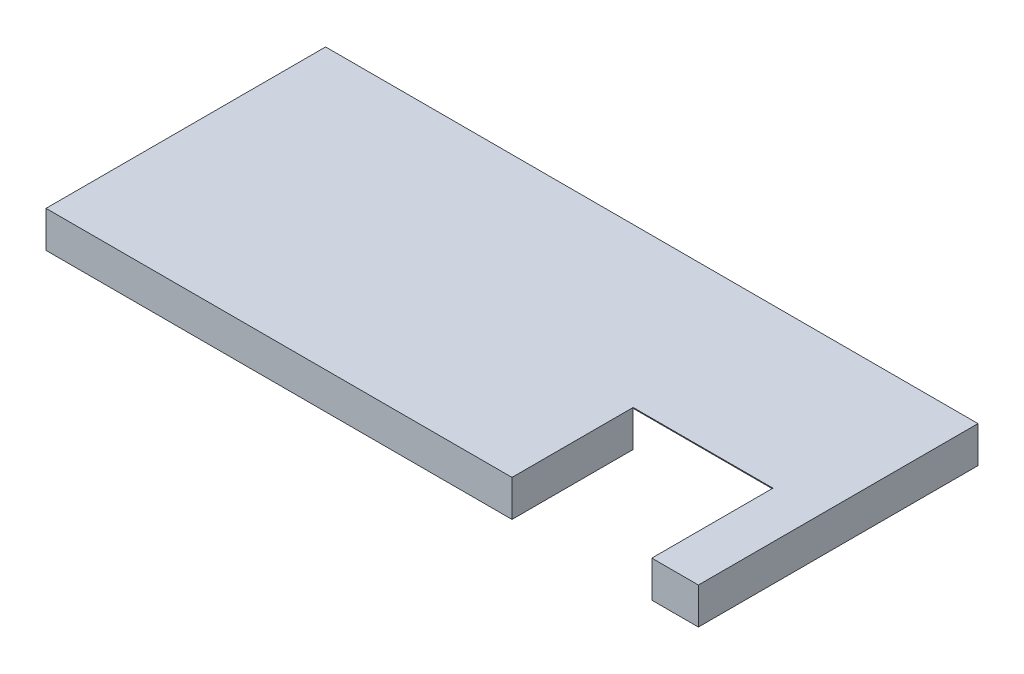
ISO-10303-21;
HEADER;
FILE_DESCRIPTION(('STEP AP214'),'2;1');
FILE_NAME('part.step','',(''),(''),'','','');
FILE_SCHEMA(('AUTOMOTIVE_DESIGN { 1 0 10303 214 1 1 1 1 }'));
ENDSEC;
DATA;
#1=APPLICATION_CONTEXT('core data for automotive mechanical design processes');
#2=APPLICATION_PROTOCOL_DEFINITION('international standard','automotive_design',2000,#1);
#3=PRODUCT_CONTEXT('',#1,'mechanical');
#4=PRODUCT('Part','Part','',(#3));
#5=PRODUCT_RELATED_PRODUCT_CATEGORY('part','',(#4));
#6=PRODUCT_DEFINITION_FORMATION('','',#4);
#7=PRODUCT_DEFINITION_CONTEXT('part definition',#1,'design');
#8=PRODUCT_DEFINITION('design','',#6,#7);
#9=PRODUCT_DEFINITION_SHAPE('','',#8);
#10=(LENGTH_UNIT() NAMED_UNIT(*) SI_UNIT(.MILLI.,.METRE.));
#11=(NAMED_UNIT(*) PLANE_ANGLE_UNIT() SI_UNIT($,.RADIAN.));
#12=(NAMED_UNIT(*) SI_UNIT($,.STERADIAN.) SOLID_ANGLE_UNIT());
#13=UNCERTAINTY_MEASURE_WITH_UNIT(LENGTH_MEASURE(1.E-05),#10,'distance_accuracy_value','');
#14=(GEOMETRIC_REPRESENTATION_CONTEXT(3) GLOBAL_UNCERTAINTY_ASSIGNED_CONTEXT((#13)) GLOBAL_UNIT_ASSIGNED_CONTEXT((#10,
#11,#12)) REPRESENTATION_CONTEXT('',''));
#15=CARTESIAN_POINT('',(0.,0.,0.));
#16=DIRECTION('',(0.,0.,1.));
#17=DIRECTION('',(1.,0.,0.));
#18=AXIS2_PLACEMENT_3D('',#15,#16,#17);
#19=CARTESIAN_POINT('',(0.,0.,0.));
#20=DIRECTION('',(0.,1.,0.));
#21=DIRECTION('',(0.,0.,1.));
#22=AXIS2_PLACEMENT_3D('',#19,#20,#21);
#23=PLANE('',#22);
#24=DIRECTION('',(0.,0.,-1.));
#25=VECTOR('',#24,1.);
#26=CARTESIAN_POINT('',(4991.,0.,1700.));
#27=LINE('',#26,#25);
#28=CARTESIAN_POINT('',(4991.,0.,2991.));
#29=VERTEX_POINT('',#28);
#30=CARTESIAN_POINT('',(4991.,0.,1700.));
#31=VERTEX_POINT('',#30);
#32=EDGE_CURVE('E318',#29,#31,#27,.T.);
#33=ORIENTED_EDGE('',*,*,#32,.F.);
#34=DIRECTION('',(1.,0.,0.));
#35=VECTOR('',#34,1.);
#36=CARTESIAN_POINT('',(5000.,0.,2991.));
#37=LINE('',#36,#35);
#38=CARTESIAN_POINT('',(9.,0.,2991.));
#39=VERTEX_POINT('',#38);
#40=EDGE_CURVE('E183',#39,#29,#37,.T.);
#41=ORIENTED_EDGE('',*,*,#40,.F.);
#42=DIRECTION('',(0.,0.,1.));
#43=VECTOR('',#42,1.);
#44=CARTESIAN_POINT('',(9.00000000000001,0.,0.));
#45=LINE('',#44,#43);
#46=CARTESIAN_POINT('',(9.00000000000034,0.,8.99999999999914));
#47=VERTEX_POINT('',#46);
#48=EDGE_CURVE('E253',#47,#39,#45,.T.);
#49=ORIENTED_EDGE('',*,*,#48,.F.);
#50=DIRECTION('',(-1.,0.,0.));
#51=VECTOR('',#50,1.);
#52=CARTESIAN_POINT('',(7000.,0.,9.00000000000001));
#53=LINE('',#52,#51);
#54=CARTESIAN_POINT('',(6991.,0.,9.00000000000001));
#55=VERTEX_POINT('',#54);
#56=EDGE_CURVE('E281',#55,#47,#53,.T.);
#57=ORIENTED_EDGE('',*,*,#56,.F.);
#58=DIRECTION('',(0.,0.,-1.));
#59=VECTOR('',#58,1.);
#60=CARTESIAN_POINT('',(6991.,0.,3000.));
#61=LINE('',#60,#59);
#62=CARTESIAN_POINT('',(6991.,0.,2991.));
#63=VERTEX_POINT('',#62);
#64=EDGE_CURVE('E289',#63,#55,#61,.T.);
#65=ORIENTED_EDGE('',*,*,#64,.F.);
#66=DIRECTION('',(1.,0.,0.));
#67=VECTOR('',#66,1.);
#68=CARTESIAN_POINT('',(6500.,0.,2991.));
#69=LINE('',#68,#67);
#70=CARTESIAN_POINT('',(6509.,0.,2991.));
#71=VERTEX_POINT('',#70);
#72=EDGE_CURVE('E297',#71,#63,#69,.T.);
#73=ORIENTED_EDGE('',*,*,#72,.F.);
#74=DIRECTION('',(0.,0.,1.));
#75=VECTOR('',#74,1.);
#76=CARTESIAN_POINT('',(6509.,0.,1700.));
#77=LINE('',#76,#75);
#78=CARTESIAN_POINT('',(6509.,0.,1700.));
#79=VERTEX_POINT('',#78);
#80=EDGE_CURVE('E309',#79,#71,#77,.T.);
#81=ORIENTED_EDGE('',*,*,#80,.F.);
#82=DIRECTION('',(1.,0.,0.));
#83=VECTOR('',#82,1.);
#84=CARTESIAN_POINT('',(6500.,0.,1700.));
#85=LINE('',#84,#83);
#86=CARTESIAN_POINT('',(6500.,0.,1700.));
#87=VERTEX_POINT('',#86);
#88=EDGE_CURVE('E184',#87,#79,#85,.T.);
#89=ORIENTED_EDGE('',*,*,#88,.F.);
#90=DIRECTION('',(1.,0.,0.));
#91=VECTOR('',#90,1.);
#92=CARTESIAN_POINT('',(6500.,0.,1700.));
#93=LINE('',#92,#91);
#94=CARTESIAN_POINT('',(5000.,0.,1700.));
#95=VERTEX_POINT('',#94);
#96=EDGE_CURVE('E191',#95,#87,#93,.T.);
#97=ORIENTED_EDGE('',*,*,#96,.F.);
#98=DIRECTION('',(1.,0.,0.));
#99=VECTOR('',#98,1.);
#100=CARTESIAN_POINT('',(5000.,0.,1700.));
#101=LINE('',#100,#99);
#102=EDGE_CURVE('E174',#31,#95,#101,.T.);
#103=ORIENTED_EDGE('',*,*,#102,.F.);
#104=EDGE_LOOP('',(#33,#41,#49,#57,#65,#73,#81,#89,#97,#103));
#105=FACE_BOUND('',#104,.T.);
#106=ADVANCED_FACE('F45',(#105),#23,.F.);
#107=CARTESIAN_POINT('',(5000.,-382.,2991.));
#108=DIRECTION('',(0.,0.,1.));
#109=DIRECTION('',(1.,0.,0.));
#110=AXIS2_PLACEMENT_3D('',#107,#108,#109);
#111=PLANE('',#110);
#112=DIRECTION('',(0.,1.,0.));
#113=VECTOR('',#112,1.);
#114=CARTESIAN_POINT('',(4991.,-382.,2991.));
#115=LINE('',#114,#113);
#116=CARTESIAN_POINT('',(4991.,-382.,2991.));
#117=VERTEX_POINT('',#116);
#118=EDGE_CURVE('E166',#117,#29,#115,.T.);
#119=ORIENTED_EDGE('',*,*,#118,.F.);
#120=DIRECTION('',(1.,0.,0.));
#121=VECTOR('',#120,1.);
#122=CARTESIAN_POINT('',(5000.,-382.,2991.));
#123=LINE('',#122,#121);
#124=CARTESIAN_POINT('',(9.00000000000034,-382.,2991.));
#125=VERTEX_POINT('',#124);
#126=EDGE_CURVE('E181',#125,#117,#123,.T.);
#127=ORIENTED_EDGE('',*,*,#126,.F.);
#128=DIRECTION('',(0.,1.,0.));
#129=VECTOR('',#128,1.);
#130=CARTESIAN_POINT('',(9.,-382.,2991.));
#131=LINE('',#130,#129);
#132=EDGE_CURVE('E204',#125,#39,#131,.T.);
#133=ORIENTED_EDGE('',*,*,#132,.T.);
#134=ORIENTED_EDGE('',*,*,#40,.T.);
#135=EDGE_LOOP('',(#119,#127,#133,#134));
#136=FACE_BOUND('',#135,.T.);
#137=ADVANCED_FACE('F179',(#136),#111,.F.);
#138=CARTESIAN_POINT('',(6500.,-382.,2991.));
#139=DIRECTION('',(0.,0.,1.));
#140=DIRECTION('',(1.,0.,0.));
#141=AXIS2_PLACEMENT_3D('',#138,#139,#140);
#142=PLANE('',#141);
#143=DIRECTION('',(0.,1.,0.));
#144=VECTOR('',#143,1.);
#145=CARTESIAN_POINT('',(6509.,-382.,2991.));
#146=LINE('',#145,#144);
#147=CARTESIAN_POINT('',(6509.,-382.,2991.));
#148=VERTEX_POINT('',#147);
#149=EDGE_CURVE('E60',#148,#71,#146,.T.);
#150=ORIENTED_EDGE('',*,*,#149,.T.);
#151=ORIENTED_EDGE('',*,*,#72,.T.);
#152=DIRECTION('',(0.,1.,0.));
#153=VECTOR('',#152,1.);
#154=CARTESIAN_POINT('',(6991.,-382.,2991.));
#155=LINE('',#154,#153);
#156=CARTESIAN_POINT('',(6991.,-382.,2991.));
#157=VERTEX_POINT('',#156);
#158=EDGE_CURVE('E292',#157,#63,#155,.T.);
#159=ORIENTED_EDGE('',*,*,#158,.F.);
#160=DIRECTION('',(1.,0.,0.));
#161=VECTOR('',#160,1.);
#162=CARTESIAN_POINT('',(6500.,-382.,2991.));
#163=LINE('',#162,#161);
#164=EDGE_CURVE('E67',#148,#157,#163,.T.);
#165=ORIENTED_EDGE('',*,*,#164,.F.);
#166=EDGE_LOOP('',(#150,#151,#159,#165));
#167=FACE_BOUND('',#166,.T.);
#168=ADVANCED_FACE('F342',(#167),#142,.F.);
#169=CARTESIAN_POINT('',(6991.,-382.,3000.));
#170=DIRECTION('',(1.,0.,0.));
#171=DIRECTION('',(0.,0.,-1.));
#172=AXIS2_PLACEMENT_3D('',#169,#170,#171);
#173=PLANE('',#172);
#174=ORIENTED_EDGE('',*,*,#158,.T.);
#175=ORIENTED_EDGE('',*,*,#64,.T.);
#176=DIRECTION('',(0.,1.,0.));
#177=VECTOR('',#176,1.);
#178=CARTESIAN_POINT('',(6991.,-382.,9.00000000000001));
#179=LINE('',#178,#177);
#180=CARTESIAN_POINT('',(6991.,-382.,9.00000000000001));
#181=VERTEX_POINT('',#180);
#182=EDGE_CURVE('E284',#181,#55,#179,.T.);
#183=ORIENTED_EDGE('',*,*,#182,.F.);
#184=DIRECTION('',(0.,0.,-1.));
#185=VECTOR('',#184,1.);
#186=CARTESIAN_POINT('',(6991.,-382.,3000.));
#187=LINE('',#186,#185);
#188=EDGE_CURVE('E288',#157,#181,#187,.T.);
#189=ORIENTED_EDGE('',*,*,#188,.F.);
#190=EDGE_LOOP('',(#174,#175,#183,#189));
#191=FACE_BOUND('',#190,.T.);
#192=ADVANCED_FACE('F348',(#191),#173,.F.);
#193=CARTESIAN_POINT('',(7000.,-382.,9.00000000000001));
#194=DIRECTION('',(0.,0.,-1.));
#195=DIRECTION('',(-1.,0.,0.));
#196=AXIS2_PLACEMENT_3D('',#193,#194,#195);
#197=PLANE('',#196);
#198=ORIENTED_EDGE('',*,*,#182,.T.);
#199=ORIENTED_EDGE('',*,*,#56,.T.);
#200=DIRECTION('',(0.,1.,0.));
#201=VECTOR('',#200,1.);
#202=CARTESIAN_POINT('',(9.00000000000034,-382.,8.99999999999914));
#203=LINE('',#202,#201);
#204=CARTESIAN_POINT('',(9.00000000000001,-382.,9.00000000000001));
#205=VERTEX_POINT('',#204);
#206=EDGE_CURVE('E256',#205,#47,#203,.T.);
#207=ORIENTED_EDGE('',*,*,#206,.F.);
#208=DIRECTION('',(-1.,0.,0.));
#209=VECTOR('',#208,1.);
#210=CARTESIAN_POINT('',(7000.,-382.,9.00000000000001));
#211=LINE('',#210,#209);
#212=EDGE_CURVE('E280',#181,#205,#211,.T.);
#213=ORIENTED_EDGE('',*,*,#212,.F.);
#214=EDGE_LOOP('',(#198,#199,#207,#213));
#215=FACE_BOUND('',#214,.T.);
#216=ADVANCED_FACE('F353',(#215),#197,.F.);
#217=CARTESIAN_POINT('',(9.00000000000001,-382.,0.));
#218=DIRECTION('',(-1.,0.,0.));
#219=DIRECTION('',(0.,0.,1.));
#220=AXIS2_PLACEMENT_3D('',#217,#218,#219);
#221=PLANE('',#220);
#222=ORIENTED_EDGE('',*,*,#206,.T.);
#223=ORIENTED_EDGE('',*,*,#48,.T.);
#224=ORIENTED_EDGE('',*,*,#132,.F.);
#225=DIRECTION('',(0.,0.,1.));
#226=VECTOR('',#225,1.);
#227=CARTESIAN_POINT('',(9.00000000000001,-382.,0.));
#228=LINE('',#227,#226);
#229=EDGE_CURVE('E189',#205,#125,#228,.T.);
#230=ORIENTED_EDGE('',*,*,#229,.F.);
#231=EDGE_LOOP('',(#222,#223,#224,#230));
#232=FACE_BOUND('',#231,.T.);
#233=ADVANCED_FACE('F357',(#232),#221,.F.);
#234=CARTESIAN_POINT('',(4.44089209850063E-13,9.,3000.));
#235=DIRECTION('',(0.,0.,-1.));
#236=DIRECTION('',(-1.,0.,0.));
#237=AXIS2_PLACEMENT_3D('',#234,#235,#236);
#238=PLANE('',#237);
#239=DIRECTION('',(1.,0.,0.));
#240=VECTOR('',#239,1.);
#241=CARTESIAN_POINT('',(4.44089209850063E-13,9.,3000.));
#242=LINE('',#241,#240);
#243=CARTESIAN_POINT('',(6500.,9.,3000.));
#244=VERTEX_POINT('',#243);
#245=CARTESIAN_POINT('',(7000.,9.,3000.));
#246=VERTEX_POINT('',#245);
#247=EDGE_CURVE('E230',#244,#246,#242,.T.);
#248=ORIENTED_EDGE('',*,*,#247,.F.);
#249=DIRECTION('',(0.,-1.,0.));
#250=VECTOR('',#249,1.);
#251=CARTESIAN_POINT('',(6500.,9.,3000.));
#252=LINE('',#251,#250);
#253=CARTESIAN_POINT('',(6500.,-382.,3000.));
#254=VERTEX_POINT('',#253);
#255=EDGE_CURVE('E212',#244,#254,#252,.T.);
#256=ORIENTED_EDGE('',*,*,#255,.T.);
#257=DIRECTION('',(-1.,0.,0.));
#258=VECTOR('',#257,1.);
#259=CARTESIAN_POINT('',(7000.,-382.,3000.));
#260=LINE('',#259,#258);
#261=CARTESIAN_POINT('',(7000.,-382.,3000.));
#262=VERTEX_POINT('',#261);
#263=EDGE_CURVE('E291',#262,#254,#260,.T.);
#264=ORIENTED_EDGE('',*,*,#263,.F.);
#265=DIRECTION('',(0.,-1.,0.));
#266=VECTOR('',#265,1.);
#267=CARTESIAN_POINT('',(7000.,9.,3000.));
#268=LINE('',#267,#266);
#269=EDGE_CURVE('E234',#246,#262,#268,.T.);
#270=ORIENTED_EDGE('',*,*,#269,.F.);
#271=EDGE_LOOP('',(#248,#256,#264,#270));
#272=FACE_BOUND('',#271,.T.);
#273=ADVANCED_FACE('F333',(#272),#238,.F.);
#274=CARTESIAN_POINT('',(7000.,9.,0.));
#275=DIRECTION('',(-1.,0.,0.));
#276=DIRECTION('',(0.,0.,1.));
#277=AXIS2_PLACEMENT_3D('',#274,#275,#276);
#278=PLANE('',#277);
#279=ORIENTED_EDGE('',*,*,#269,.T.);
#280=DIRECTION('',(0.,0.,1.));
#281=VECTOR('',#280,1.);
#282=CARTESIAN_POINT('',(7000.,-382.,0.));
#283=LINE('',#282,#281);
#284=CARTESIAN_POINT('',(7000.,-382.,0.));
#285=VERTEX_POINT('',#284);
#286=EDGE_CURVE('E277',#285,#262,#283,.T.);
#287=ORIENTED_EDGE('',*,*,#286,.F.);
#288=DIRECTION('',(0.,-1.,0.));
#289=VECTOR('',#288,1.);
#290=CARTESIAN_POINT('',(7000.,9.,0.));
#291=LINE('',#290,#289);
#292=CARTESIAN_POINT('',(7000.,9.,0.));
#293=VERTEX_POINT('',#292);
#294=EDGE_CURVE('E11',#293,#285,#291,.T.);
#295=ORIENTED_EDGE('',*,*,#294,.F.);
#296=DIRECTION('',(0.,0.,-1.));
#297=VECTOR('',#296,1.);
#298=CARTESIAN_POINT('',(7000.,9.,0.));
#299=LINE('',#298,#297);
#300=EDGE_CURVE('E217',#246,#293,#299,.T.);
#301=ORIENTED_EDGE('',*,*,#300,.F.);
#302=EDGE_LOOP('',(#279,#287,#295,#301));
#303=FACE_BOUND('',#302,.T.);
#304=ADVANCED_FACE('F47',(#303),#278,.F.);
#305=CARTESIAN_POINT('',(0.,9.,0.));
#306=DIRECTION('',(0.,0.,1.));
#307=DIRECTION('',(1.,0.,0.));
#308=AXIS2_PLACEMENT_3D('',#305,#306,#307);
#309=PLANE('',#308);
#310=ORIENTED_EDGE('',*,*,#294,.T.);
#311=DIRECTION('',(1.,0.,0.));
#312=VECTOR('',#311,1.);
#313=CARTESIAN_POINT('',(0.,-382.,0.));
#314=LINE('',#313,#312);
#315=CARTESIAN_POINT('',(0.,-382.,0.));
#316=VERTEX_POINT('',#315);
#317=EDGE_CURVE('E248',#316,#285,#314,.T.);
#318=ORIENTED_EDGE('',*,*,#317,.F.);
#319=DIRECTION('',(0.,-1.,0.));
#320=VECTOR('',#319,1.);
#321=CARTESIAN_POINT('',(0.,9.,0.));
#322=LINE('',#321,#320);
#323=CARTESIAN_POINT('',(0.,9.,0.));
#324=VERTEX_POINT('',#323);
#325=EDGE_CURVE('E53',#324,#316,#322,.T.);
#326=ORIENTED_EDGE('',*,*,#325,.F.);
#327=DIRECTION('',(-1.,0.,0.));
#328=VECTOR('',#327,1.);
#329=CARTESIAN_POINT('',(0.,9.,0.));
#330=LINE('',#329,#328);
#331=EDGE_CURVE('E226',#293,#324,#330,.T.);
#332=ORIENTED_EDGE('',*,*,#331,.F.);
#333=EDGE_LOOP('',(#310,#318,#326,#332));
#334=FACE_BOUND('',#333,.T.);
#335=ADVANCED_FACE('F251',(#334),#309,.F.);
#336=CARTESIAN_POINT('',(0.,9.,0.));
#337=DIRECTION('',(1.,0.,0.));
#338=DIRECTION('',(0.,0.,-1.));
#339=AXIS2_PLACEMENT_3D('',#336,#337,#338);
#340=PLANE('',#339);
#341=ORIENTED_EDGE('',*,*,#325,.T.);
#342=DIRECTION('',(0.,0.,-1.));
#343=VECTOR('',#342,1.);
#344=CARTESIAN_POINT('',(4.44089209850063E-13,-382.,3000.));
#345=LINE('',#344,#343);
#346=CARTESIAN_POINT('',(4.44089209850063E-13,-382.,3000.));
#347=VERTEX_POINT('',#346);
#348=EDGE_CURVE('E192',#347,#316,#345,.T.);
#349=ORIENTED_EDGE('',*,*,#348,.F.);
#350=DIRECTION('',(0.,-1.,0.));
#351=VECTOR('',#350,1.);
#352=CARTESIAN_POINT('',(4.44089209850063E-13,9.,3000.));
#353=LINE('',#352,#351);
#354=CARTESIAN_POINT('',(4.44089209850063E-13,9.,3000.));
#355=VERTEX_POINT('',#354);
#356=EDGE_CURVE('E236',#355,#347,#353,.T.);
#357=ORIENTED_EDGE('',*,*,#356,.F.);
#358=DIRECTION('',(0.,0.,1.));
#359=VECTOR('',#358,1.);
#360=CARTESIAN_POINT('',(0.,9.,0.));
#361=LINE('',#360,#359);
#362=EDGE_CURVE('E228',#324,#355,#361,.T.);
#363=ORIENTED_EDGE('',*,*,#362,.F.);
#364=EDGE_LOOP('',(#341,#349,#357,#363));
#365=FACE_BOUND('',#364,.T.);
#366=ADVANCED_FACE('F241',(#365),#340,.F.);
#367=ORIENTED_EDGE('',*,*,#356,.T.);
#368=DIRECTION('',(-1.,0.,0.));
#369=VECTOR('',#368,1.);
#370=CARTESIAN_POINT('',(5000.,-382.,3000.));
#371=LINE('',#370,#369);
#372=CARTESIAN_POINT('',(5000.,-382.,3000.));
#373=VERTEX_POINT('',#372);
#374=EDGE_CURVE('E198',#373,#347,#371,.T.);
#375=ORIENTED_EDGE('',*,*,#374,.F.);
#376=DIRECTION('',(0.,-1.,0.));
#377=VECTOR('',#376,1.);
#378=CARTESIAN_POINT('',(5000.,9.,3000.));
#379=LINE('',#378,#377);
#380=CARTESIAN_POINT('',(5000.,9.,3000.));
#381=VERTEX_POINT('',#380);
#382=EDGE_CURVE('E221',#381,#373,#379,.T.);
#383=ORIENTED_EDGE('',*,*,#382,.F.);
#384=EDGE_CURVE('E231',#355,#381,#242,.T.);
#385=ORIENTED_EDGE('',*,*,#384,.F.);
#386=EDGE_LOOP('',(#367,#375,#383,#385));
#387=FACE_BOUND('',#386,.T.);
#388=ADVANCED_FACE('F270',(#387),#238,.F.);
#389=CARTESIAN_POINT('',(0.,9.,0.));
#390=DIRECTION('',(0.,1.,0.));
#391=DIRECTION('',(0.,0.,1.));
#392=AXIS2_PLACEMENT_3D('',#389,#390,#391);
#393=PLANE('',#392);
#394=DIRECTION('',(0.,0.,1.));
#395=VECTOR('',#394,1.);
#396=CARTESIAN_POINT('',(6500.,9.,3000.));
#397=LINE('',#396,#395);
#398=CARTESIAN_POINT('',(6500.,9.,1700.));
#399=VERTEX_POINT('',#398);
#400=EDGE_CURVE('E195',#399,#244,#397,.T.);
#401=ORIENTED_EDGE('',*,*,#400,.T.);
#402=ORIENTED_EDGE('',*,*,#247,.T.);
#403=ORIENTED_EDGE('',*,*,#300,.T.);
#404=ORIENTED_EDGE('',*,*,#331,.T.);
#405=ORIENTED_EDGE('',*,*,#362,.T.);
#406=ORIENTED_EDGE('',*,*,#384,.T.);
#407=DIRECTION('',(0.,0.,-1.));
#408=VECTOR('',#407,1.);
#409=CARTESIAN_POINT('',(5000.,9.,3000.));
#410=LINE('',#409,#408);
#411=CARTESIAN_POINT('',(5000.,9.,1700.));
#412=VERTEX_POINT('',#411);
#413=EDGE_CURVE('E207',#381,#412,#410,.T.);
#414=ORIENTED_EDGE('',*,*,#413,.T.);
#415=DIRECTION('',(1.,0.,0.));
#416=VECTOR('',#415,1.);
#417=CARTESIAN_POINT('',(6500.,9.,1700.));
#418=LINE('',#417,#416);
#419=EDGE_CURVE('E210',#412,#399,#418,.T.);
#420=ORIENTED_EDGE('',*,*,#419,.T.);
#421=EDGE_LOOP('',(#401,#402,#403,#404,#405,#406,#414,#420));
#422=FACE_BOUND('',#421,.T.);
#423=ADVANCED_FACE('F272',(#422),#393,.T.);
#424=CARTESIAN_POINT('',(6500.,9.,3000.));
#425=DIRECTION('',(1.,0.,0.));
#426=DIRECTION('',(0.,0.,-1.));
#427=AXIS2_PLACEMENT_3D('',#424,#425,#426);
#428=PLANE('',#427);
#429=DIRECTION('',(0.,-1.,0.));
#430=VECTOR('',#429,1.);
#431=CARTESIAN_POINT('',(6500.,9.,1700.));
#432=LINE('',#431,#430);
#433=EDGE_CURVE('E214',#399,#87,#432,.T.);
#434=ORIENTED_EDGE('',*,*,#433,.T.);
#435=DIRECTION('',(0.,1.,0.));
#436=VECTOR('',#435,1.);
#437=CARTESIAN_POINT('',(6500.,-382.,1700.));
#438=LINE('',#437,#436);
#439=CARTESIAN_POINT('',(6500.,-382.,1700.));
#440=VERTEX_POINT('',#439);
#441=EDGE_CURVE('E300',#440,#87,#438,.T.);
#442=ORIENTED_EDGE('',*,*,#441,.F.);
#443=DIRECTION('',(0.,0.,-1.));
#444=VECTOR('',#443,1.);
#445=CARTESIAN_POINT('',(6500.,-382.,3000.));
#446=LINE('',#445,#444);
#447=EDGE_CURVE('E299',#254,#440,#446,.T.);
#448=ORIENTED_EDGE('',*,*,#447,.F.);
#449=ORIENTED_EDGE('',*,*,#255,.F.);
#450=ORIENTED_EDGE('',*,*,#400,.F.);
#451=EDGE_LOOP('',(#434,#442,#448,#449,#450));
#452=FACE_BOUND('',#451,.T.);
#453=ADVANCED_FACE('F337',(#452),#428,.F.);
#454=CARTESIAN_POINT('',(6500.,9.,1700.));
#455=DIRECTION('',(0.,0.,-1.));
#456=DIRECTION('',(-1.,0.,0.));
#457=AXIS2_PLACEMENT_3D('',#454,#455,#456);
#458=PLANE('',#457);
#459=ORIENTED_EDGE('',*,*,#96,.T.);
#460=ORIENTED_EDGE('',*,*,#433,.F.);
#461=ORIENTED_EDGE('',*,*,#419,.F.);
#462=DIRECTION('',(0.,-1.,0.));
#463=VECTOR('',#462,1.);
#464=CARTESIAN_POINT('',(5000.,9.,1700.));
#465=LINE('',#464,#463);
#466=EDGE_CURVE('E218',#412,#95,#465,.T.);
#467=ORIENTED_EDGE('',*,*,#466,.T.);
#468=EDGE_LOOP('',(#459,#460,#461,#467));
#469=FACE_BOUND('',#468,.T.);
#470=ADVANCED_FACE('F328',(#469),#458,.F.);
#471=CARTESIAN_POINT('',(5000.,9.,3000.));
#472=DIRECTION('',(-1.,0.,0.));
#473=DIRECTION('',(0.,0.,1.));
#474=AXIS2_PLACEMENT_3D('',#471,#472,#473);
#475=PLANE('',#474);
#476=ORIENTED_EDGE('',*,*,#382,.T.);
#477=DIRECTION('',(0.,0.,1.));
#478=VECTOR('',#477,1.);
#479=CARTESIAN_POINT('',(5000.,-382.,3000.));
#480=LINE('',#479,#478);
#481=CARTESIAN_POINT('',(5000.,-382.,1700.));
#482=VERTEX_POINT('',#481);
#483=EDGE_CURVE('E203',#482,#373,#480,.T.);
#484=ORIENTED_EDGE('',*,*,#483,.F.);
#485=DIRECTION('',(0.,1.,0.));
#486=VECTOR('',#485,1.);
#487=CARTESIAN_POINT('',(5000.,-382.,1700.));
#488=LINE('',#487,#486);
#489=EDGE_CURVE('E266',#482,#95,#488,.T.);
#490=ORIENTED_EDGE('',*,*,#489,.T.);
#491=ORIENTED_EDGE('',*,*,#466,.F.);
#492=ORIENTED_EDGE('',*,*,#413,.F.);
#493=EDGE_LOOP('',(#476,#484,#490,#491,#492));
#494=FACE_BOUND('',#493,.T.);
#495=ADVANCED_FACE('F265',(#494),#475,.F.);
#496=CARTESIAN_POINT('',(0.,-382.,0.));
#497=DIRECTION('',(0.,1.,0.));
#498=DIRECTION('',(0.,0.,1.));
#499=AXIS2_PLACEMENT_3D('',#496,#497,#498);
#500=PLANE('',#499);
#501=ORIENTED_EDGE('',*,*,#483,.T.);
#502=ORIENTED_EDGE('',*,*,#374,.T.);
#503=ORIENTED_EDGE('',*,*,#348,.T.);
#504=ORIENTED_EDGE('',*,*,#317,.T.);
#505=ORIENTED_EDGE('',*,*,#286,.T.);
#506=ORIENTED_EDGE('',*,*,#263,.T.);
#507=ORIENTED_EDGE('',*,*,#447,.T.);
#508=DIRECTION('',(1.,0.,0.));
#509=VECTOR('',#508,1.);
#510=CARTESIAN_POINT('',(6500.,-382.,1700.));
#511=LINE('',#510,#509);
#512=CARTESIAN_POINT('',(6509.,-382.,1700.));
#513=VERTEX_POINT('',#512);
#514=EDGE_CURVE('E311',#440,#513,#511,.T.);
#515=ORIENTED_EDGE('',*,*,#514,.T.);
#516=DIRECTION('',(0.,0.,1.));
#517=VECTOR('',#516,1.);
#518=CARTESIAN_POINT('',(6509.,-382.,1700.));
#519=LINE('',#518,#517);
#520=EDGE_CURVE('E308',#513,#148,#519,.T.);
#521=ORIENTED_EDGE('',*,*,#520,.T.);
#522=ORIENTED_EDGE('',*,*,#164,.T.);
#523=ORIENTED_EDGE('',*,*,#188,.T.);
#524=ORIENTED_EDGE('',*,*,#212,.T.);
#525=ORIENTED_EDGE('',*,*,#229,.T.);
#526=ORIENTED_EDGE('',*,*,#126,.T.);
#527=DIRECTION('',(0.,0.,-1.));
#528=VECTOR('',#527,1.);
#529=CARTESIAN_POINT('',(4991.,-382.,1700.));
#530=LINE('',#529,#528);
#531=CARTESIAN_POINT('',(4991.,-382.,1700.));
#532=VERTEX_POINT('',#531);
#533=EDGE_CURVE('E163',#117,#532,#530,.T.);
#534=ORIENTED_EDGE('',*,*,#533,.T.);
#535=DIRECTION('',(1.,0.,0.));
#536=VECTOR('',#535,1.);
#537=CARTESIAN_POINT('',(5000.,-382.,1700.));
#538=LINE('',#537,#536);
#539=EDGE_CURVE('E173',#532,#482,#538,.T.);
#540=ORIENTED_EDGE('',*,*,#539,.T.);
#541=EDGE_LOOP('',(#501,#502,#503,#504,#505,#506,#507,#515,#521,#522,#523,#524,#525,#526,#534,#540));
#542=FACE_BOUND('',#541,.T.);
#543=ADVANCED_FACE('F187',(#542),#500,.F.);
#544=CARTESIAN_POINT('',(6500.,-382.,1700.));
#545=DIRECTION('',(0.,0.,1.));
#546=DIRECTION('',(1.,0.,0.));
#547=AXIS2_PLACEMENT_3D('',#544,#545,#546);
#548=PLANE('',#547);
#549=ORIENTED_EDGE('',*,*,#88,.T.);
#550=DIRECTION('',(0.,1.,0.));
#551=VECTOR('',#550,1.);
#552=CARTESIAN_POINT('',(6509.,-382.,1700.));
#553=LINE('',#552,#551);
#554=EDGE_CURVE('E304',#513,#79,#553,.T.);
#555=ORIENTED_EDGE('',*,*,#554,.F.);
#556=ORIENTED_EDGE('',*,*,#514,.F.);
#557=ORIENTED_EDGE('',*,*,#441,.T.);
#558=EDGE_LOOP('',(#549,#555,#556,#557));
#559=FACE_BOUND('',#558,.T.);
#560=ADVANCED_FACE('F339',(#559),#548,.F.);
#561=CARTESIAN_POINT('',(6509.,-382.,1700.));
#562=DIRECTION('',(-1.,0.,0.));
#563=DIRECTION('',(0.,0.,1.));
#564=AXIS2_PLACEMENT_3D('',#561,#562,#563);
#565=PLANE('',#564);
#566=ORIENTED_EDGE('',*,*,#80,.T.);
#567=ORIENTED_EDGE('',*,*,#149,.F.);
#568=ORIENTED_EDGE('',*,*,#520,.F.);
#569=ORIENTED_EDGE('',*,*,#554,.T.);
#570=EDGE_LOOP('',(#566,#567,#568,#569));
#571=FACE_BOUND('',#570,.T.);
#572=ADVANCED_FACE('F358',(#571),#565,.F.);
#573=CARTESIAN_POINT('',(4991.,-382.,1700.));
#574=DIRECTION('',(1.,0.,0.));
#575=DIRECTION('',(0.,0.,-1.));
#576=AXIS2_PLACEMENT_3D('',#573,#574,#575);
#577=PLANE('',#576);
#578=ORIENTED_EDGE('',*,*,#32,.T.);
#579=DIRECTION('',(0.,1.,0.));
#580=VECTOR('',#579,1.);
#581=CARTESIAN_POINT('',(4991.,-382.,1700.));
#582=LINE('',#581,#580);
#583=EDGE_CURVE('E169',#532,#31,#582,.T.);
#584=ORIENTED_EDGE('',*,*,#583,.F.);
#585=ORIENTED_EDGE('',*,*,#533,.F.);
#586=ORIENTED_EDGE('',*,*,#118,.T.);
#587=EDGE_LOOP('',(#578,#584,#585,#586));
#588=FACE_BOUND('',#587,.T.);
#589=ADVANCED_FACE('F165',(#588),#577,.F.);
#590=CARTESIAN_POINT('',(5000.,-382.,1700.));
#591=DIRECTION('',(0.,0.,1.));
#592=DIRECTION('',(1.,0.,0.));
#593=AXIS2_PLACEMENT_3D('',#590,#591,#592);
#594=PLANE('',#593);
#595=ORIENTED_EDGE('',*,*,#102,.T.);
#596=ORIENTED_EDGE('',*,*,#489,.F.);
#597=ORIENTED_EDGE('',*,*,#539,.F.);
#598=ORIENTED_EDGE('',*,*,#583,.T.);
#599=EDGE_LOOP('',(#595,#596,#597,#598));
#600=FACE_BOUND('',#599,.T.);
#601=ADVANCED_FACE('F323',(#600),#594,.F.);
#602=CLOSED_SHELL('',(#106,#137,#168,#192,#216,#233,#273,#304,#335,#366,#388,#423,#453,#470,
#495,#543,#560,#572,#589,#601));
#603=MANIFOLD_SOLID_BREP('B2',#602);
#604=ADVANCED_BREP_SHAPE_REPRESENTATION('',(#18,#603),#14);
#605=SHAPE_DEFINITION_REPRESENTATION(#9,#604);
ENDSEC;
END-ISO-10303-21;
